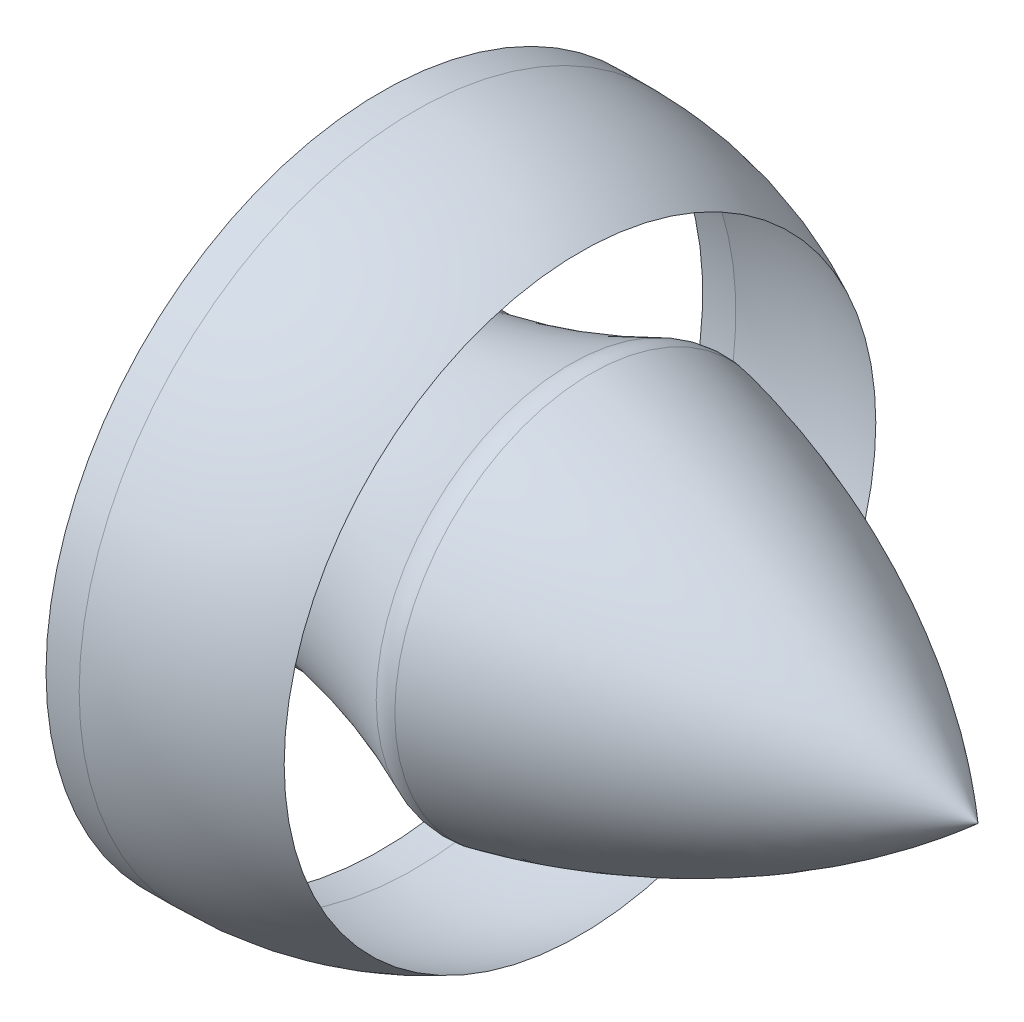
ISO-10303-21;
HEADER;
FILE_DESCRIPTION(('STEP AP214'),'2;1');
FILE_NAME('part.step','',(''),(''),'','','');
FILE_SCHEMA(('AUTOMOTIVE_DESIGN { 1 0 10303 214 1 1 1 1 }'));
ENDSEC;
DATA;
#1=APPLICATION_CONTEXT('core data for automotive mechanical design processes');
#2=APPLICATION_PROTOCOL_DEFINITION('international standard','automotive_design',2000,#1);
#3=PRODUCT_CONTEXT('',#1,'mechanical');
#4=PRODUCT('Part','Part','',(#3));
#5=PRODUCT_RELATED_PRODUCT_CATEGORY('part','',(#4));
#6=PRODUCT_DEFINITION_FORMATION('','',#4);
#7=PRODUCT_DEFINITION_CONTEXT('part definition',#1,'design');
#8=PRODUCT_DEFINITION('design','',#6,#7);
#9=PRODUCT_DEFINITION_SHAPE('','',#8);
#10=(LENGTH_UNIT() NAMED_UNIT(*) SI_UNIT(.MILLI.,.METRE.));
#11=(NAMED_UNIT(*) PLANE_ANGLE_UNIT() SI_UNIT($,.RADIAN.));
#12=(NAMED_UNIT(*) SI_UNIT($,.STERADIAN.) SOLID_ANGLE_UNIT());
#13=UNCERTAINTY_MEASURE_WITH_UNIT(LENGTH_MEASURE(1.E-05),#10,'distance_accuracy_value','');
#14=(GEOMETRIC_REPRESENTATION_CONTEXT(3) GLOBAL_UNCERTAINTY_ASSIGNED_CONTEXT((#13)) GLOBAL_UNIT_ASSIGNED_CONTEXT((#10,
#11,#12)) REPRESENTATION_CONTEXT('',''));
#15=CARTESIAN_POINT('',(0.,0.,0.));
#16=DIRECTION('',(0.,0.,1.));
#17=DIRECTION('',(1.,0.,0.));
#18=AXIS2_PLACEMENT_3D('',#15,#16,#17);
#19=CARTESIAN_POINT('',(0.,50.5,0.));
#20=DIRECTION('',(1.,0.,0.));
#21=DIRECTION('',(0.,0.,-1.));
#22=AXIS2_PLACEMENT_3D('',#19,#20,#21);
#23=PLANE('',#22);
#24=CARTESIAN_POINT('',(0.,0.,0.));
#25=DIRECTION('',(-1.,0.,0.));
#26=DIRECTION('',(0.,0.,1.));
#27=AXIS2_PLACEMENT_3D('',#24,#25,#26);
#28=CIRCLE('',#27,48.5);
#29=CARTESIAN_POINT('',(0.,0.,48.5));
#30=VERTEX_POINT('',#29);
#31=EDGE_CURVE('E11',#30,#30,#28,.T.);
#32=ORIENTED_EDGE('',*,*,#31,.F.);
#33=EDGE_LOOP('',(#32));
#34=FACE_BOUND('',#33,.T.);
#35=CARTESIAN_POINT('',(0.,0.,0.));
#36=DIRECTION('',(-1.,0.,0.));
#37=DIRECTION('',(0.,0.,1.));
#38=AXIS2_PLACEMENT_3D('',#35,#36,#37);
#39=CIRCLE('',#38,50.5);
#40=CARTESIAN_POINT('',(0.,0.,50.5));
#41=VERTEX_POINT('',#40);
#42=EDGE_CURVE('E69',#41,#41,#39,.T.);
#43=ORIENTED_EDGE('',*,*,#42,.T.);
#44=EDGE_LOOP('',(#43));
#45=FACE_BOUND('',#44,.T.);
#46=ADVANCED_FACE('F49',(#34,#45),#23,.F.);
#47=CARTESIAN_POINT('',(-2128.63176728947,0.,0.));
#48=DIRECTION('',(-1.,0.,0.));
#49=DIRECTION('',(0.,0.,1.));
#50=AXIS2_PLACEMENT_3D('',#47,#48,#49);
#51=CYLINDRICAL_SURFACE('',#50,50.5);
#52=CARTESIAN_POINT('',(4.99999999999989,0.,0.));
#53=DIRECTION('',(-1.,0.,0.));
#54=DIRECTION('',(0.,0.,1.));
#55=AXIS2_PLACEMENT_3D('',#52,#53,#54);
#56=CIRCLE('',#55,50.5);
#57=CARTESIAN_POINT('',(4.99999999999989,0.,50.5));
#58=VERTEX_POINT('',#57);
#59=EDGE_CURVE('E64',#58,#58,#56,.T.);
#60=ORIENTED_EDGE('',*,*,#59,.T.);
#61=EDGE_LOOP('',(#60));
#62=FACE_BOUND('',#61,.T.);
#63=ORIENTED_EDGE('',*,*,#42,.F.);
#64=EDGE_LOOP('',(#63));
#65=FACE_BOUND('',#64,.T.);
#66=ADVANCED_FACE('F74',(#62,#65),#51,.T.);
#67=CARTESIAN_POINT('',(5.20864826154936,0.,0.));
#68=DIRECTION('',(-1.,0.,0.));
#69=DIRECTION('',(0.,0.,1.));
#70=AXIS2_PLACEMENT_3D('',#67,#68,#69);
#71=DEGENERATE_TOROIDAL_SURFACE('',#70,4.49960423405746,55.,.F.);
#72=CARTESIAN_POINT('',(29.9999999999998,0.,0.));
#73=DIRECTION('',(-1.,0.,0.));
#74=DIRECTION('',(0.,0.,1.));
#75=AXIS2_PLACEMENT_3D('',#72,#73,#74);
#76=CIRCLE('',#75,44.59610717723);
#77=CARTESIAN_POINT('',(29.9999999999998,0.,44.59610717723));
#78=VERTEX_POINT('',#77);
#79=EDGE_CURVE('E60',#78,#78,#76,.T.);
#80=ORIENTED_EDGE('',*,*,#79,.T.);
#81=EDGE_LOOP('',(#80));
#82=FACE_BOUND('',#81,.T.);
#83=ORIENTED_EDGE('',*,*,#59,.F.);
#84=EDGE_LOOP('',(#83));
#85=FACE_BOUND('',#84,.T.);
#86=ADVANCED_FACE('F76',(#82,#85),#71,.F.);
#87=CARTESIAN_POINT('',(10.0367376639392,0.,0.));
#88=DIRECTION('',(-1.,0.,0.));
#89=DIRECTION('',(0.,0.,1.));
#90=AXIS2_PLACEMENT_3D('',#87,#88,#89);
#91=DEGENERATE_TOROIDAL_SURFACE('',#90,1.24566587859345,50.,.F.);
#92=ORIENTED_EDGE('',*,*,#79,.F.);
#93=EDGE_LOOP('',(#92));
#94=FACE_BOUND('',#93,.T.);
#95=CARTESIAN_POINT('',(4.99999999999989,0.,0.));
#96=DIRECTION('',(-1.,0.,0.));
#97=DIRECTION('',(0.,0.,1.));
#98=AXIS2_PLACEMENT_3D('',#95,#96,#97);
#99=CIRCLE('',#98,48.5);
#100=CARTESIAN_POINT('',(4.99999999999989,0.,48.5));
#101=VERTEX_POINT('',#100);
#102=EDGE_CURVE('E56',#101,#101,#99,.T.);
#103=ORIENTED_EDGE('',*,*,#102,.T.);
#104=EDGE_LOOP('',(#103));
#105=FACE_BOUND('',#104,.T.);
#106=ADVANCED_FACE('F83',(#94,#105),#91,.T.);
#107=CARTESIAN_POINT('',(-2128.63176728947,0.,0.));
#108=DIRECTION('',(-1.,0.,0.));
#109=DIRECTION('',(0.,0.,1.));
#110=AXIS2_PLACEMENT_3D('',#107,#108,#109);
#111=CYLINDRICAL_SURFACE('',#110,48.5);
#112=ORIENTED_EDGE('',*,*,#102,.F.);
#113=EDGE_LOOP('',(#112));
#114=FACE_BOUND('',#113,.T.);
#115=ORIENTED_EDGE('',*,*,#31,.T.);
#116=EDGE_LOOP('',(#115));
#117=FACE_BOUND('',#116,.T.);
#118=ADVANCED_FACE('F51',(#114,#117),#111,.F.);
#119=CLOSED_SHELL('',(#46,#66,#86,#106,#118));
#120=MANIFOLD_SOLID_BREP('B2',#119);
#121=CARTESIAN_POINT('',(-2128.63176728947,0.,0.));
#122=DIRECTION('',(-1.,0.,0.));
#123=DIRECTION('',(0.,0.,1.));
#124=AXIS2_PLACEMENT_3D('',#121,#122,#123);
#125=CYLINDRICAL_SURFACE('',#124,19.999999999538);
#126=CARTESIAN_POINT('',(4.99999999999989,0.,0.));
#127=DIRECTION('',(-1.,0.,0.));
#128=DIRECTION('',(0.,0.,1.));
#129=AXIS2_PLACEMENT_3D('',#126,#127,#128);
#130=CIRCLE('',#129,19.9999999990761);
#131=CARTESIAN_POINT('',(4.99999999999989,0.,19.9999999990761));
#132=VERTEX_POINT('',#131);
#133=EDGE_CURVE('E152',#132,#132,#130,.T.);
#134=ORIENTED_EDGE('',*,*,#133,.F.);
#135=EDGE_LOOP('',(#134));
#136=FACE_BOUND('',#135,.T.);
#137=CARTESIAN_POINT('',(-20.9999999999999,0.,0.));
#138=DIRECTION('',(-1.,0.,0.));
#139=DIRECTION('',(0.,0.,1.));
#140=AXIS2_PLACEMENT_3D('',#137,#138,#139);
#141=CIRCLE('',#140,20.);
#142=CARTESIAN_POINT('',(-20.9999999999999,0.,20.));
#143=VERTEX_POINT('',#142);
#144=EDGE_CURVE('E153',#143,#143,#141,.T.);
#145=ORIENTED_EDGE('',*,*,#144,.T.);
#146=EDGE_LOOP('',(#145));
#147=FACE_BOUND('',#146,.T.);
#148=ADVANCED_FACE('F126',(#136,#147),#125,.F.);
#149=CARTESIAN_POINT('',(-29.5627444578403,0.,0.));
#150=DIRECTION('',(-1.,0.,0.));
#151=DIRECTION('',(0.,0.,1.));
#152=AXIS2_PLACEMENT_3D('',#149,#150,#151);
#153=TOROIDAL_SURFACE('',#152,178.26746257391,161.997447554547);
#154=CARTESIAN_POINT('',(29.9999999999998,0.,0.));
#155=DIRECTION('',(-1.,0.,0.));
#156=DIRECTION('',(0.,0.,1.));
#157=AXIS2_PLACEMENT_3D('',#154,#155,#156);
#158=CIRCLE('',#157,27.6173630495752);
#159=CARTESIAN_POINT('',(29.9999999999998,0.,27.6173630495752));
#160=VERTEX_POINT('',#159);
#161=EDGE_CURVE('E149',#160,#160,#158,.T.);
#162=ORIENTED_EDGE('',*,*,#161,.F.);
#163=EDGE_LOOP('',(#162));
#164=FACE_BOUND('',#163,.T.);
#165=ORIENTED_EDGE('',*,*,#133,.T.);
#166=EDGE_LOOP('',(#165));
#167=FACE_BOUND('',#166,.T.);
#168=ADVANCED_FACE('F145',(#164,#167),#153,.T.);
#169=CARTESIAN_POINT('',(-1.8786116856048,0.,-116.684148161639));
#170=DIRECTION('',(0.,-1.,0.));
#171=DIRECTION('',(0.,0.,1.));
#172=AXIS2_PLACEMENT_3D('',#169,#170,#171);
#173=CIRCLE('',#172,147.78082426635);
#174=TRIMMED_CURVE('',#173,(PARAMETER_VALUE(-0.660679065843169)),
(PARAMETER_VALUE(0.660679065843169)),.T.,.PARAMETER.);
#175=CARTESIAN_POINT('',(-1.8786116856048,0.,0.));
#176=DIRECTION('',(-1.,0.,0.));
#177=AXIS1_PLACEMENT('',#175,#176);
#178=SURFACE_OF_REVOLUTION('',#174,#177);
#179=CARTESIAN_POINT('',(88.8075591930603,0.,0.));
#180=VERTEX_POINT('',#179);
#181=VERTEX_LOOP('',#180);
#182=FACE_BOUND('',#181,.T.);
#183=ORIENTED_EDGE('',*,*,#161,.T.);
#184=EDGE_LOOP('',(#183));
#185=FACE_BOUND('',#184,.T.);
#186=ADVANCED_FACE('F141',(#182,#185),#178,.F.);
#187=CARTESIAN_POINT('',(3.63325426413622,0.,-98.0511994277654));
#188=DIRECTION('',(0.,-1.,0.));
#189=DIRECTION('',(0.,0.,1.));
#190=AXIS2_PLACEMENT_3D('',#187,#188,#189);
#191=CIRCLE('',#190,130.664656576393);
#192=TRIMMED_CURVE('',#191,(PARAMETER_VALUE(-0.722124189481639)),
(PARAMETER_VALUE(0.722124189481639)),.T.,.PARAMETER.);
#193=CARTESIAN_POINT('',(3.63325426413622,0.,0.));
#194=DIRECTION('',(-1.,0.,0.));
#195=AXIS1_PLACEMENT('',#193,#194);
#196=SURFACE_OF_REVOLUTION('',#192,#195);
#197=CARTESIAN_POINT('',(31.652351239922,0.,0.));
#198=DIRECTION('',(-1.,0.,0.));
#199=DIRECTION('',(0.,0.,1.));
#200=AXIS2_PLACEMENT_3D('',#197,#198,#199);
#201=CIRCLE('',#200,29.5739653434829);
#202=CARTESIAN_POINT('',(31.652351239922,0.,29.5739653434829));
#203=VERTEX_POINT('',#202);
#204=EDGE_CURVE('E47',#203,#203,#201,.F.);
#205=ORIENTED_EDGE('',*,*,#204,.T.);
#206=EDGE_LOOP('',(#205));
#207=FACE_BOUND('',#206,.T.);
#208=CARTESIAN_POINT('',(90.,0.,0.));
#209=VERTEX_POINT('',#208);
#210=VERTEX_LOOP('',#209);
#211=FACE_BOUND('',#210,.T.);
#212=ADVANCED_FACE('F144',(#207,#211),#196,.T.);
#213=CARTESIAN_POINT('',(-12.4589896749037,0.,0.));
#214=DIRECTION('',(-1.,0.,0.));
#215=DIRECTION('',(0.,0.,1.));
#216=AXIS2_PLACEMENT_3D('',#213,#214,#215);
#217=TOROIDAL_SURFACE('',#216,120.464123819448,100.);
#218=CARTESIAN_POINT('',(28.5306913709281,0.,0.));
#219=DIRECTION('',(-1.,0.,0.));
#220=DIRECTION('',(0.,0.,1.));
#221=AXIS2_PLACEMENT_3D('',#218,#219,#220);
#222=CIRCLE('',#221,29.2509337219574);
#223=CARTESIAN_POINT('',(28.5306913709281,0.,29.2509337219574));
#224=VERTEX_POINT('',#223);
#225=EDGE_CURVE('E135',#224,#224,#222,.T.);
#226=ORIENTED_EDGE('',*,*,#225,.T.);
#227=EDGE_LOOP('',(#226));
#228=FACE_BOUND('',#227,.T.);
#229=CARTESIAN_POINT('',(5.449907467477,0.,0.));
#230=DIRECTION('',(-1.,0.,0.));
#231=DIRECTION('',(0.,0.,1.));
#232=AXIS2_PLACEMENT_3D('',#229,#230,#231);
#233=CIRCLE('',#232,22.0808355884501);
#234=CARTESIAN_POINT('',(5.449907467477,0.,22.0808355884501));
#235=VERTEX_POINT('',#234);
#236=EDGE_CURVE('E170',#235,#235,#233,.F.);
#237=ORIENTED_EDGE('',*,*,#236,.T.);
#238=EDGE_LOOP('',(#237));
#239=FACE_BOUND('',#238,.T.);
#240=ADVANCED_FACE('F177',(#228,#239),#217,.F.);
#241=CARTESIAN_POINT('',(-2128.63176728947,0.,0.));
#242=DIRECTION('',(-1.,0.,0.));
#243=DIRECTION('',(0.,0.,1.));
#244=AXIS2_PLACEMENT_3D('',#241,#242,#243);
#245=CYLINDRICAL_SURFACE('',#244,22.);
#246=CARTESIAN_POINT('',(-16.9999999996535,0.,0.));
#247=DIRECTION('',(-1.,0.,0.));
#248=DIRECTION('',(0.,0.,1.));
#249=AXIS2_PLACEMENT_3D('',#246,#247,#248);
#250=CIRCLE('',#249,22.);
#251=CARTESIAN_POINT('',(-16.9999999996535,0.,22.));
#252=VERTEX_POINT('',#251);
#253=EDGE_CURVE('E166',#252,#252,#250,.F.);
#254=ORIENTED_EDGE('',*,*,#253,.T.);
#255=EDGE_LOOP('',(#254));
#256=FACE_BOUND('',#255,.T.);
#257=CARTESIAN_POINT('',(4.55446261035819,0.,0.));
#258=DIRECTION('',(-1.,0.,0.));
#259=DIRECTION('',(0.,0.,1.));
#260=AXIS2_PLACEMENT_3D('',#257,#258,#259);
#261=CIRCLE('',#260,22.);
#262=CARTESIAN_POINT('',(4.55446261035819,0.,22.));
#263=VERTEX_POINT('',#262);
#264=EDGE_CURVE('E158',#263,#263,#261,.T.);
#265=ORIENTED_EDGE('',*,*,#264,.T.);
#266=EDGE_LOOP('',(#265));
#267=FACE_BOUND('',#266,.T.);
#268=ADVANCED_FACE('F200',(#256,#267),#245,.T.);
#269=CARTESIAN_POINT('',(-16.9999999996534,0.,0.));
#270=DIRECTION('',(-1.,0.,0.));
#271=DIRECTION('',(0.,0.,1.));
#272=AXIS2_PLACEMENT_3D('',#269,#270,#271);
#273=TOROIDAL_SURFACE('',#272,17.,5.);
#274=ORIENTED_EDGE('',*,*,#253,.F.);
#275=EDGE_LOOP('',(#274));
#276=FACE_BOUND('',#275,.T.);
#277=ORIENTED_EDGE('',*,*,#144,.F.);
#278=EDGE_LOOP('',(#277));
#279=FACE_BOUND('',#278,.T.);
#280=ADVANCED_FACE('F186',(#276,#279),#273,.T.);
#281=CARTESIAN_POINT('',(4.55446261035797,0.,0.));
#282=DIRECTION('',(-1.,0.,0.));
#283=DIRECTION('',(0.,0.,1.));
#284=AXIS2_PLACEMENT_3D('',#281,#282,#283);
#285=TOROIDAL_SURFACE('',#284,27.,5.);
#286=ORIENTED_EDGE('',*,*,#236,.F.);
#287=EDGE_LOOP('',(#286));
#288=FACE_BOUND('',#287,.T.);
#289=ORIENTED_EDGE('',*,*,#264,.F.);
#290=EDGE_LOOP('',(#289));
#291=FACE_BOUND('',#290,.T.);
#292=ADVANCED_FACE('F181',(#288,#291),#285,.F.);
#293=CARTESIAN_POINT('',(30.5801754232197,0.,0.));
#294=DIRECTION('',(1.,0.,0.));
#295=DIRECTION('',(0.,0.,-1.));
#296=AXIS2_PLACEMENT_3D('',#293,#294,#295);
#297=TOROIDAL_SURFACE('',#296,24.6902742170828,5.);
#298=ORIENTED_EDGE('',*,*,#204,.F.);
#299=EDGE_LOOP('',(#298));
#300=FACE_BOUND('',#299,.T.);
#301=ORIENTED_EDGE('',*,*,#225,.F.);
#302=EDGE_LOOP('',(#301));
#303=FACE_BOUND('',#302,.T.);
#304=ADVANCED_FACE('F128',(#300,#303),#297,.T.);
#305=CLOSED_SHELL('',(#148,#168,#186,#212,#240,#268,#280,#292,#304));
#306=MANIFOLD_SOLID_BREP('B6',#305);
#307=ADVANCED_BREP_SHAPE_REPRESENTATION('',(#18,#120,#306),#14);
#308=SHAPE_DEFINITION_REPRESENTATION(#9,#307);
ENDSEC;
END-ISO-10303-21;
